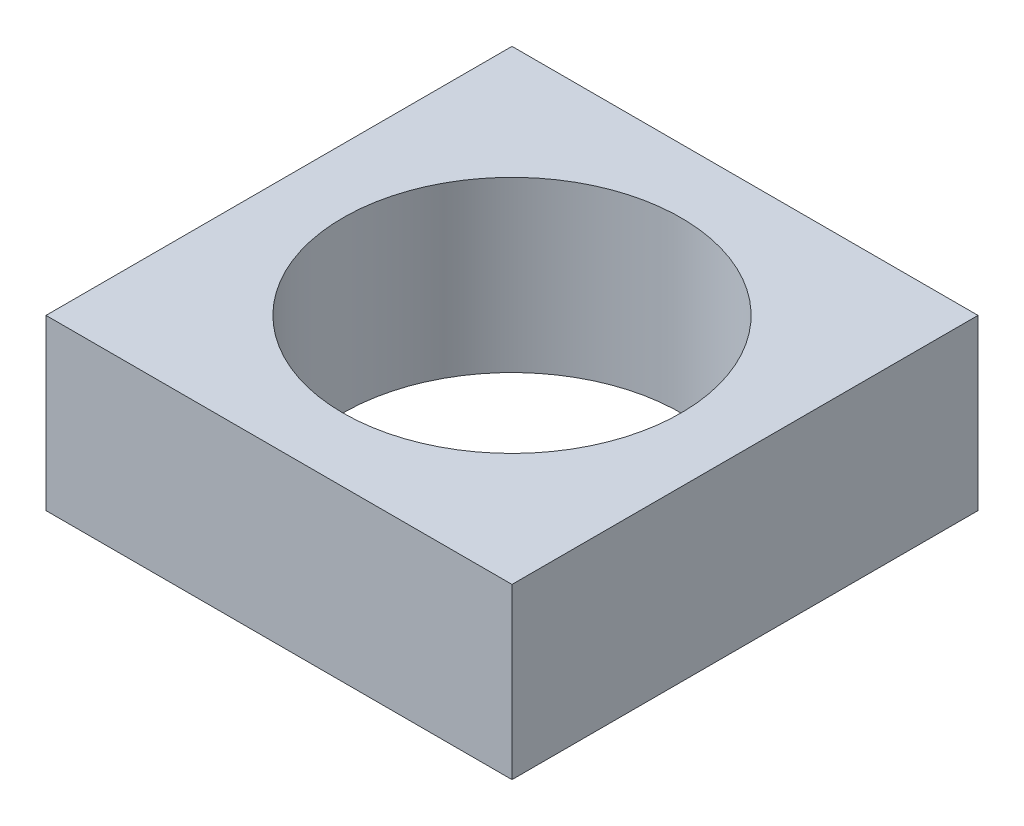
ISO-10303-21;
HEADER;
FILE_DESCRIPTION(('STEP AP214'),'2;1');
FILE_NAME('part.step','',(''),(''),'','','');
FILE_SCHEMA(('AUTOMOTIVE_DESIGN { 1 0 10303 214 1 1 1 1 }'));
ENDSEC;
DATA;
#1=APPLICATION_CONTEXT('core data for automotive mechanical design processes');
#2=APPLICATION_PROTOCOL_DEFINITION('international standard','automotive_design',2000,#1);
#3=PRODUCT_CONTEXT('',#1,'mechanical');
#4=PRODUCT('Part','Part','',(#3));
#5=PRODUCT_RELATED_PRODUCT_CATEGORY('part','',(#4));
#6=PRODUCT_DEFINITION_FORMATION('','',#4);
#7=PRODUCT_DEFINITION_CONTEXT('part definition',#1,'design');
#8=PRODUCT_DEFINITION('design','',#6,#7);
#9=PRODUCT_DEFINITION_SHAPE('','',#8);
#10=(LENGTH_UNIT() NAMED_UNIT(*) SI_UNIT(.MILLI.,.METRE.));
#11=(NAMED_UNIT(*) PLANE_ANGLE_UNIT() SI_UNIT($,.RADIAN.));
#12=(NAMED_UNIT(*) SI_UNIT($,.STERADIAN.) SOLID_ANGLE_UNIT());
#13=UNCERTAINTY_MEASURE_WITH_UNIT(LENGTH_MEASURE(1.E-05),#10,'distance_accuracy_value','');
#14=(GEOMETRIC_REPRESENTATION_CONTEXT(3) GLOBAL_UNCERTAINTY_ASSIGNED_CONTEXT((#13)) GLOBAL_UNIT_ASSIGNED_CONTEXT((#10,
#11,#12)) REPRESENTATION_CONTEXT('',''));
#15=CARTESIAN_POINT('',(0.,0.,0.));
#16=DIRECTION('',(0.,0.,1.));
#17=DIRECTION('',(1.,0.,0.));
#18=AXIS2_PLACEMENT_3D('',#15,#16,#17);
#19=CARTESIAN_POINT('',(0.,12.7,0.));
#20=DIRECTION('',(0.,-1.,0.));
#21=DIRECTION('',(0.,0.,-1.));
#22=AXIS2_PLACEMENT_3D('',#19,#20,#21);
#23=PLANE('',#22);
#24=DIRECTION('',(0.,0.,-1.));
#25=VECTOR('',#24,1.);
#26=CARTESIAN_POINT('',(17.5,12.7,17.5));
#27=LINE('',#26,#25);
#28=CARTESIAN_POINT('',(17.5,12.7,17.5));
#29=VERTEX_POINT('',#28);
#30=CARTESIAN_POINT('',(17.5,12.7,-17.5));
#31=VERTEX_POINT('',#30);
#32=EDGE_CURVE('E85',#29,#31,#27,.T.);
#33=ORIENTED_EDGE('',*,*,#32,.T.);
#34=DIRECTION('',(-1.,0.,0.));
#35=VECTOR('',#34,1.);
#36=CARTESIAN_POINT('',(-17.5,12.7,-17.5));
#37=LINE('',#36,#35);
#38=CARTESIAN_POINT('',(-17.5,12.7,-17.5));
#39=VERTEX_POINT('',#38);
#40=EDGE_CURVE('E80',#31,#39,#37,.T.);
#41=ORIENTED_EDGE('',*,*,#40,.T.);
#42=DIRECTION('',(0.,0.,1.));
#43=VECTOR('',#42,1.);
#44=CARTESIAN_POINT('',(-17.5,12.7,17.5));
#45=LINE('',#44,#43);
#46=CARTESIAN_POINT('',(-17.5,12.7,17.5));
#47=VERTEX_POINT('',#46);
#48=EDGE_CURVE('E83',#39,#47,#45,.T.);
#49=ORIENTED_EDGE('',*,*,#48,.T.);
#50=DIRECTION('',(1.,0.,0.));
#51=VECTOR('',#50,1.);
#52=CARTESIAN_POINT('',(-17.5,12.7,17.5));
#53=LINE('',#52,#51);
#54=EDGE_CURVE('E50',#47,#29,#53,.T.);
#55=ORIENTED_EDGE('',*,*,#54,.T.);
#56=EDGE_LOOP('',(#33,#41,#49,#55));
#57=FACE_BOUND('',#56,.T.);
#58=CARTESIAN_POINT('',(0.,12.7,0.));
#59=DIRECTION('',(0.,1.,0.));
#60=DIRECTION('',(0.,0.,1.));
#61=AXIS2_PLACEMENT_3D('',#58,#59,#60);
#62=CIRCLE('',#61,12.7);
#63=CARTESIAN_POINT('',(0.,12.7,12.7));
#64=VERTEX_POINT('',#63);
#65=EDGE_CURVE('E100',#64,#64,#62,.T.);
#66=ORIENTED_EDGE('',*,*,#65,.F.);
#67=EDGE_LOOP('',(#66));
#68=FACE_BOUND('',#67,.T.);
#69=ADVANCED_FACE('F33',(#57,#68),#23,.F.);
#70=CARTESIAN_POINT('',(0.,0.,0.));
#71=DIRECTION('',(0.,-1.,0.));
#72=DIRECTION('',(0.,0.,-1.));
#73=AXIS2_PLACEMENT_3D('',#70,#71,#72);
#74=PLANE('',#73);
#75=DIRECTION('',(0.,0.,-1.));
#76=VECTOR('',#75,1.);
#77=CARTESIAN_POINT('',(17.5,0.,17.5));
#78=LINE('',#77,#76);
#79=CARTESIAN_POINT('',(17.5,0.,17.5));
#80=VERTEX_POINT('',#79);
#81=CARTESIAN_POINT('',(17.5,0.,-17.5));
#82=VERTEX_POINT('',#81);
#83=EDGE_CURVE('E97',#80,#82,#78,.T.);
#84=ORIENTED_EDGE('',*,*,#83,.F.);
#85=DIRECTION('',(1.,0.,0.));
#86=VECTOR('',#85,1.);
#87=CARTESIAN_POINT('',(-17.5,0.,17.5));
#88=LINE('',#87,#86);
#89=CARTESIAN_POINT('',(-17.5,0.,17.5));
#90=VERTEX_POINT('',#89);
#91=EDGE_CURVE('E73',#90,#80,#88,.T.);
#92=ORIENTED_EDGE('',*,*,#91,.F.);
#93=DIRECTION('',(0.,0.,1.));
#94=VECTOR('',#93,1.);
#95=CARTESIAN_POINT('',(-17.5,0.,17.5));
#96=LINE('',#95,#94);
#97=CARTESIAN_POINT('',(-17.5,0.,-17.5));
#98=VERTEX_POINT('',#97);
#99=EDGE_CURVE('E67',#98,#90,#96,.T.);
#100=ORIENTED_EDGE('',*,*,#99,.F.);
#101=DIRECTION('',(-1.,0.,0.));
#102=VECTOR('',#101,1.);
#103=CARTESIAN_POINT('',(-17.5,0.,-17.5));
#104=LINE('',#103,#102);
#105=EDGE_CURVE('E89',#82,#98,#104,.T.);
#106=ORIENTED_EDGE('',*,*,#105,.F.);
#107=EDGE_LOOP('',(#84,#92,#100,#106));
#108=FACE_BOUND('',#107,.T.);
#109=CARTESIAN_POINT('',(0.,0.,0.));
#110=DIRECTION('',(0.,1.,0.));
#111=DIRECTION('',(0.,0.,1.));
#112=AXIS2_PLACEMENT_3D('',#109,#110,#111);
#113=CIRCLE('',#112,12.7);
#114=CARTESIAN_POINT('',(0.,0.,12.7));
#115=VERTEX_POINT('',#114);
#116=EDGE_CURVE('E112',#115,#115,#113,.T.);
#117=ORIENTED_EDGE('',*,*,#116,.T.);
#118=EDGE_LOOP('',(#117));
#119=FACE_BOUND('',#118,.T.);
#120=ADVANCED_FACE('F108',(#108,#119),#74,.T.);
#121=CARTESIAN_POINT('',(17.5,12.7,17.5));
#122=DIRECTION('',(-1.,0.,0.));
#123=DIRECTION('',(0.,0.,1.));
#124=AXIS2_PLACEMENT_3D('',#121,#122,#123);
#125=PLANE('',#124);
#126=ORIENTED_EDGE('',*,*,#83,.T.);
#127=DIRECTION('',(0.,-1.,0.));
#128=VECTOR('',#127,1.);
#129=CARTESIAN_POINT('',(17.5,12.7,-17.5));
#130=LINE('',#129,#128);
#131=EDGE_CURVE('E11',#31,#82,#130,.T.);
#132=ORIENTED_EDGE('',*,*,#131,.F.);
#133=ORIENTED_EDGE('',*,*,#32,.F.);
#134=DIRECTION('',(0.,-1.,0.));
#135=VECTOR('',#134,1.);
#136=CARTESIAN_POINT('',(17.5,12.7,17.5));
#137=LINE('',#136,#135);
#138=EDGE_CURVE('E93',#29,#80,#137,.T.);
#139=ORIENTED_EDGE('',*,*,#138,.T.);
#140=EDGE_LOOP('',(#126,#132,#133,#139));
#141=FACE_BOUND('',#140,.T.);
#142=ADVANCED_FACE('F35',(#141),#125,.F.);
#143=CARTESIAN_POINT('',(-17.5,12.7,-17.5));
#144=DIRECTION('',(0.,0.,1.));
#145=DIRECTION('',(1.,0.,0.));
#146=AXIS2_PLACEMENT_3D('',#143,#144,#145);
#147=PLANE('',#146);
#148=ORIENTED_EDGE('',*,*,#105,.T.);
#149=DIRECTION('',(0.,-1.,0.));
#150=VECTOR('',#149,1.);
#151=CARTESIAN_POINT('',(-17.5,12.7,-17.5));
#152=LINE('',#151,#150);
#153=EDGE_CURVE('E42',#39,#98,#152,.T.);
#154=ORIENTED_EDGE('',*,*,#153,.F.);
#155=ORIENTED_EDGE('',*,*,#40,.F.);
#156=ORIENTED_EDGE('',*,*,#131,.T.);
#157=EDGE_LOOP('',(#148,#154,#155,#156));
#158=FACE_BOUND('',#157,.T.);
#159=ADVANCED_FACE('F88',(#158),#147,.F.);
#160=CARTESIAN_POINT('',(-17.5,12.7,17.5));
#161=DIRECTION('',(1.,0.,0.));
#162=DIRECTION('',(0.,0.,-1.));
#163=AXIS2_PLACEMENT_3D('',#160,#161,#162);
#164=PLANE('',#163);
#165=ORIENTED_EDGE('',*,*,#99,.T.);
#166=DIRECTION('',(0.,-1.,0.));
#167=VECTOR('',#166,1.);
#168=CARTESIAN_POINT('',(-17.5,12.7,17.5));
#169=LINE('',#168,#167);
#170=EDGE_CURVE('E90',#47,#90,#169,.T.);
#171=ORIENTED_EDGE('',*,*,#170,.F.);
#172=ORIENTED_EDGE('',*,*,#48,.F.);
#173=ORIENTED_EDGE('',*,*,#153,.T.);
#174=EDGE_LOOP('',(#165,#171,#172,#173));
#175=FACE_BOUND('',#174,.T.);
#176=ADVANCED_FACE('F91',(#175),#164,.F.);
#177=CARTESIAN_POINT('',(-17.5,12.7,17.5));
#178=DIRECTION('',(0.,0.,-1.));
#179=DIRECTION('',(-1.,0.,0.));
#180=AXIS2_PLACEMENT_3D('',#177,#178,#179);
#181=PLANE('',#180);
#182=ORIENTED_EDGE('',*,*,#91,.T.);
#183=ORIENTED_EDGE('',*,*,#138,.F.);
#184=ORIENTED_EDGE('',*,*,#54,.F.);
#185=ORIENTED_EDGE('',*,*,#170,.T.);
#186=EDGE_LOOP('',(#182,#183,#184,#185));
#187=FACE_BOUND('',#186,.T.);
#188=ADVANCED_FACE('F105',(#187),#181,.F.);
#189=CARTESIAN_POINT('',(0.,12.7,0.));
#190=DIRECTION('',(0.,-1.,0.));
#191=DIRECTION('',(0.,0.,-1.));
#192=AXIS2_PLACEMENT_3D('',#189,#190,#191);
#193=CYLINDRICAL_SURFACE('',#192,12.7);
#194=ORIENTED_EDGE('',*,*,#65,.T.);
#195=EDGE_LOOP('',(#194));
#196=FACE_BOUND('',#195,.T.);
#197=ORIENTED_EDGE('',*,*,#116,.F.);
#198=EDGE_LOOP('',(#197));
#199=FACE_BOUND('',#198,.T.);
#200=ADVANCED_FACE('F118',(#196,#199),#193,.F.);
#201=CLOSED_SHELL('',(#69,#120,#142,#159,#176,#188,#200));
#202=MANIFOLD_SOLID_BREP('B2',#201);
#203=ADVANCED_BREP_SHAPE_REPRESENTATION('',(#18,#202),#14);
#204=SHAPE_DEFINITION_REPRESENTATION(#9,#203);
ENDSEC;
END-ISO-10303-21;
